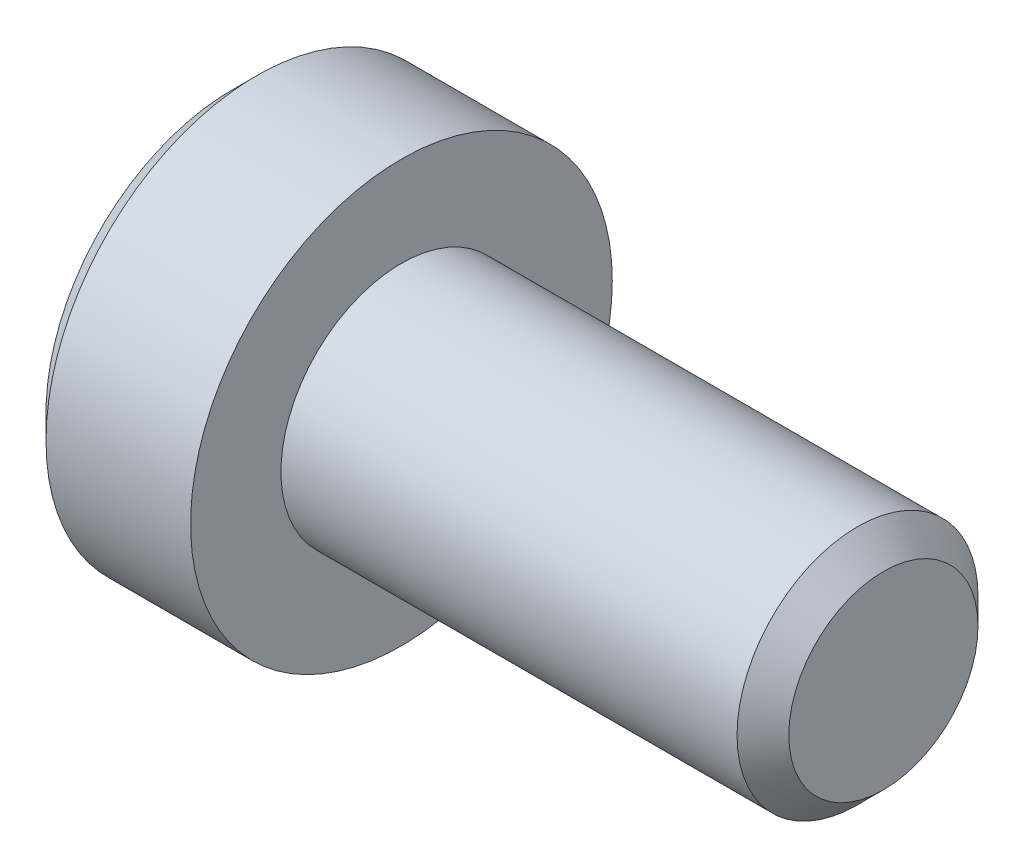
ISO-10303-21;
HEADER;
FILE_DESCRIPTION(('STEP AP214'),'2;1');
FILE_NAME('part.step','',(''),(''),'','','');
FILE_SCHEMA(('AUTOMOTIVE_DESIGN { 1 0 10303 214 1 1 1 1 }'));
ENDSEC;
DATA;
#1=APPLICATION_CONTEXT('core data for automotive mechanical design processes');
#2=APPLICATION_PROTOCOL_DEFINITION('international standard','automotive_design',2000,#1);
#3=PRODUCT_CONTEXT('',#1,'mechanical');
#4=PRODUCT('Part','Part','',(#3));
#5=PRODUCT_RELATED_PRODUCT_CATEGORY('part','',(#4));
#6=PRODUCT_DEFINITION_FORMATION('','',#4);
#7=PRODUCT_DEFINITION_CONTEXT('part definition',#1,'design');
#8=PRODUCT_DEFINITION('design','',#6,#7);
#9=PRODUCT_DEFINITION_SHAPE('','',#8);
#10=(LENGTH_UNIT() NAMED_UNIT(*) SI_UNIT(.MILLI.,.METRE.));
#11=(NAMED_UNIT(*) PLANE_ANGLE_UNIT() SI_UNIT($,.RADIAN.));
#12=(NAMED_UNIT(*) SI_UNIT($,.STERADIAN.) SOLID_ANGLE_UNIT());
#13=UNCERTAINTY_MEASURE_WITH_UNIT(LENGTH_MEASURE(1.E-05),#10,'distance_accuracy_value','');
#14=(GEOMETRIC_REPRESENTATION_CONTEXT(3) GLOBAL_UNCERTAINTY_ASSIGNED_CONTEXT((#13)) GLOBAL_UNIT_ASSIGNED_CONTEXT((#10,
#11,#12)) REPRESENTATION_CONTEXT('',''));
#15=CARTESIAN_POINT('',(0.,0.,0.));
#16=DIRECTION('',(0.,0.,1.));
#17=DIRECTION('',(1.,0.,0.));
#18=AXIS2_PLACEMENT_3D('',#15,#16,#17);
#19=CARTESIAN_POINT('',(8.,-1.60191,1.5705));
#20=DIRECTION('',(1.,0.,0.));
#21=DIRECTION('',(0.,0.,-1.));
#22=AXIS2_PLACEMENT_3D('',#19,#20,#21);
#23=PLANE('',#22);
#24=CARTESIAN_POINT('',(8.,0.,0.));
#25=DIRECTION('',(-1.,0.,0.));
#26=DIRECTION('',(0.,0.,1.));
#27=AXIS2_PLACEMENT_3D('',#24,#25,#26);
#28=CIRCLE('',#27,1.5705);
#29=CARTESIAN_POINT('',(8.,0.,1.5705));
#30=VERTEX_POINT('',#29);
#31=EDGE_CURVE('E20',#30,#30,#28,.T.);
#32=ORIENTED_EDGE('',*,*,#31,.F.);
#33=EDGE_LOOP('',(#32));
#34=FACE_BOUND('',#33,.T.);
#35=ADVANCED_FACE('F16',(#34),#23,.T.);
#36=CARTESIAN_POINT('',(-2.8,0.,1.4433756729741));
#37=DIRECTION('',(0.,0.500000000000019,-0.866025403784427));
#38=DIRECTION('',(1.,0.,0.));
#39=AXIS2_PLACEMENT_3D('',#36,#37,#38);
#40=PLANE('',#39);
#41=DIRECTION('',(0.,0.866025403784427,0.500000000000019));
#42=VECTOR('',#41,1.);
#43=CARTESIAN_POINT('',(-2.8,-0.625,1.08253175473056));
#44=LINE('',#43,#42);
#45=CARTESIAN_POINT('',(-2.8,-1.25,0.72168783648703));
#46=VERTEX_POINT('',#45);
#47=CARTESIAN_POINT('',(-2.8,0.,1.4433756729741));
#48=VERTEX_POINT('',#47);
#49=EDGE_CURVE('E68',#46,#48,#44,.T.);
#50=ORIENTED_EDGE('',*,*,#49,.T.);
#51=DIRECTION('',(-1.,0.,0.));
#52=VECTOR('',#51,1.);
#53=CARTESIAN_POINT('',(-1.54583333333333,0.,1.4433756729741));
#54=LINE('',#53,#52);
#55=CARTESIAN_POINT('',(-0.5,0.,1.4433756729741));
#56=VERTEX_POINT('',#55);
#57=EDGE_CURVE('E77',#56,#48,#54,.T.);
#58=ORIENTED_EDGE('',*,*,#57,.F.);
#59=CARTESIAN_POINT('',(-0.499999999999983,-1.25000000000001,0.721687836487024));
#60=CARTESIAN_POINT('',(-0.481684715704141,-1.19507007027311,0.753401646201419));
#61=CARTESIAN_POINT('',(-0.46502792318762,-1.13966598617425,0.7853892090701));
#62=CARTESIAN_POINT('',(-0.435953992125149,-1.0278985333212,0.849918178061453));
#63=CARTESIAN_POINT('',(-0.423547137711292,-0.971533179322117,0.882460730365793));
#64=CARTESIAN_POINT('',(-0.404234974341288,-0.859500978900713,0.947142551437001));
#65=CARTESIAN_POINT('',(-0.397201117248052,-0.803851365239746,0.97927187086446));
#66=CARTESIAN_POINT('',(-0.388805730081513,-0.692290424711271,1.04368160990963));
#67=CARTESIAN_POINT('',(-0.387437246233859,-0.636379503059216,1.07596179557608));
#68=CARTESIAN_POINT('',(-0.390291431346726,-0.531915943931439,1.13627385955901));
#69=CARTESIAN_POINT('',(-0.393813303260144,-0.483347630847629,1.16431478819204));
#70=CARTESIAN_POINT('',(-0.404973312948833,-0.38652741139707,1.22021396795482));
#71=CARTESIAN_POINT('',(-0.412615259230404,-0.338275839655658,1.24807202588855));
#72=CARTESIAN_POINT('',(-0.431718645836452,-0.241256161422176,1.30408636323334));
#73=CARTESIAN_POINT('',(-0.443261026386437,-0.192500327885292,1.33223555685043));
#74=CARTESIAN_POINT('',(-0.469457350524593,-0.0957156437469469,1.38811422029114));
#75=CARTESIAN_POINT('',(-0.484105142970129,-0.0476855541782974,1.4158444054328));
#76=CARTESIAN_POINT('',(-0.5,0.,1.4433756729741));
#77=B_SPLINE_CURVE_WITH_KNOTS('',3,(#59,#60,#61,#62,#63,#64,#65,#66,#67,#68,#69,#70,#71,#72,#73,
#74,#75,#76),.UNSPECIFIED.,.F.,.F.,(4,2,2,2,2,2,2,2,4),(0.,0.198135007223034,0.396746135641943,
0.590442253845577,0.783900555561138,0.952317364144941,1.12089012112152,1.29320101405544,
1.46517373344688),.UNSPECIFIED.);
#78=CARTESIAN_POINT('',(-0.499999999999983,-1.25000000000001,0.721687836487033));
#79=VERTEX_POINT('',#78);
#80=EDGE_CURVE('E63',#79,#56,#77,.T.);
#81=ORIENTED_EDGE('',*,*,#80,.F.);
#82=DIRECTION('',(1.,0.,0.));
#83=VECTOR('',#82,1.);
#84=CARTESIAN_POINT('',(-1.54583333333333,-1.25,0.72168783648703));
#85=LINE('',#84,#83);
#86=EDGE_CURVE('E99',#46,#79,#85,.T.);
#87=ORIENTED_EDGE('',*,*,#86,.F.);
#88=EDGE_LOOP('',(#50,#58,#81,#87));
#89=FACE_BOUND('',#88,.T.);
#90=ADVANCED_FACE('F78',(#89),#40,.T.);
#91=CARTESIAN_POINT('',(8.,0.,0.));
#92=DIRECTION('',(-1.,0.,0.));
#93=DIRECTION('',(0.,0.,1.));
#94=AXIS2_PLACEMENT_3D('',#91,#92,#93);
#95=CONICAL_SURFACE('',#94,1.5705,0.785398163397448);
#96=ORIENTED_EDGE('',*,*,#31,.T.);
#97=EDGE_LOOP('',(#96));
#98=FACE_BOUND('',#97,.T.);
#99=CARTESIAN_POINT('',(7.5705,0.,0.));
#100=DIRECTION('',(-1.,0.,0.));
#101=DIRECTION('',(0.,0.,1.));
#102=AXIS2_PLACEMENT_3D('',#99,#100,#101);
#103=CIRCLE('',#102,2.);
#104=CARTESIAN_POINT('',(7.5705,0.,2.));
#105=VERTEX_POINT('',#104);
#106=EDGE_CURVE('E95',#105,#105,#103,.T.);
#107=ORIENTED_EDGE('',*,*,#106,.F.);
#108=EDGE_LOOP('',(#107));
#109=FACE_BOUND('',#108,.T.);
#110=ADVANCED_FACE('F214',(#98,#109),#95,.T.);
#111=CARTESIAN_POINT('',(-2.8,1.25,0.72168783648703));
#112=DIRECTION('',(0.,-0.500000000000019,-0.866025403784427));
#113=DIRECTION('',(1.,0.,0.));
#114=AXIS2_PLACEMENT_3D('',#111,#112,#113);
#115=PLANE('',#114);
#116=DIRECTION('',(0.,0.866025403784427,-0.500000000000019));
#117=VECTOR('',#116,1.);
#118=CARTESIAN_POINT('',(-2.8,0.625,1.08253175473056));
#119=LINE('',#118,#117);
#120=CARTESIAN_POINT('',(-2.8,1.25,0.72168783648703));
#121=VERTEX_POINT('',#120);
#122=EDGE_CURVE('E81',#48,#121,#119,.T.);
#123=ORIENTED_EDGE('',*,*,#122,.T.);
#124=DIRECTION('',(-1.,0.,0.));
#125=VECTOR('',#124,1.);
#126=CARTESIAN_POINT('',(-1.54583333333333,1.25,0.72168783648703));
#127=LINE('',#126,#125);
#128=CARTESIAN_POINT('',(-0.499999999999981,1.25000000000001,0.721687836487027));
#129=VERTEX_POINT('',#128);
#130=EDGE_CURVE('E92',#129,#121,#127,.T.);
#131=ORIENTED_EDGE('',*,*,#130,.F.);
#132=CARTESIAN_POINT('',(-0.5,0.,1.4433756729741));
#133=CARTESIAN_POINT('',(-0.481684715704157,0.054929929726902,1.4116618632597));
#134=CARTESIAN_POINT('',(-0.465027923187634,0.110334013825759,1.37967430039102));
#135=CARTESIAN_POINT('',(-0.435953992125161,0.222101466678814,1.31514533139967));
#136=CARTESIAN_POINT('',(-0.423547137711301,0.278466820677898,1.28260277909533));
#137=CARTESIAN_POINT('',(-0.404234974341294,0.390499021099304,1.21792095802412));
#138=CARTESIAN_POINT('',(-0.397201117248057,0.446148634760272,1.18579163859666));
#139=CARTESIAN_POINT('',(-0.388805730081514,0.557709575288749,1.12138189955149));
#140=CARTESIAN_POINT('',(-0.387437246233859,0.613620496940806,1.08910171388504));
#141=CARTESIAN_POINT('',(-0.390291431346724,0.718084056068582,1.0287896499021));
#142=CARTESIAN_POINT('',(-0.39381330326014,0.766652369152391,1.00074872126908));
#143=CARTESIAN_POINT('',(-0.404973312948827,0.863472588602949,0.944849541506299));
#144=CARTESIAN_POINT('',(-0.412615259230397,0.911724160344359,0.916991483572571));
#145=CARTESIAN_POINT('',(-0.431718645836441,1.00874383857784,0.860977146227778));
#146=CARTESIAN_POINT('',(-0.443261026386426,1.05749967211472,0.832827952610692));
#147=CARTESIAN_POINT('',(-0.469457350524579,1.15428435625307,0.776949289169984));
#148=CARTESIAN_POINT('',(-0.484105142970113,1.20231444582171,0.749219104028321));
#149=CARTESIAN_POINT('',(-0.499999999999983,1.25000000000001,0.721687836487024));
#150=B_SPLINE_CURVE_WITH_KNOTS('',3,(#132,#133,#134,#135,#136,#137,#138,#139,#140,#141,#142,
#143,#144,#145,#146,#147,#148,#149),.UNSPECIFIED.,.F.,.F.,(4,2,2,2,2,2,2,2,4),(0.,
0.198135007223038,0.396746135641951,0.590442253845588,0.783900555561154,0.952317364144953,
1.12089012112153,1.29320101405544,1.46517373344688),.UNSPECIFIED.);
#151=EDGE_CURVE('E85',#56,#129,#150,.T.);
#152=ORIENTED_EDGE('',*,*,#151,.F.);
#153=ORIENTED_EDGE('',*,*,#57,.T.);
#154=EDGE_LOOP('',(#123,#131,#152,#153));
#155=FACE_BOUND('',#154,.T.);
#156=ADVANCED_FACE('F90',(#155),#115,.T.);
#157=CARTESIAN_POINT('',(-2.8,-1.25,0.72168783648703));
#158=DIRECTION('',(0.,1.,0.));
#159=DIRECTION('',(1.,0.,0.));
#160=AXIS2_PLACEMENT_3D('',#157,#158,#159);
#161=PLANE('',#160);
#162=DIRECTION('',(0.,0.,1.));
#163=VECTOR('',#162,1.);
#164=CARTESIAN_POINT('',(-2.8,-1.25,0.));
#165=LINE('',#164,#163);
#166=CARTESIAN_POINT('',(-2.8,-1.25,-0.72168783648703));
#167=VERTEX_POINT('',#166);
#168=EDGE_CURVE('E193',#167,#46,#165,.T.);
#169=ORIENTED_EDGE('',*,*,#168,.T.);
#170=ORIENTED_EDGE('',*,*,#86,.T.);
#171=CARTESIAN_POINT('',(-0.499999999999983,-1.25,0.721687836487043));
#172=CARTESIAN_POINT('',(-0.48168471570414,-1.25,0.658260217058255));
#173=CARTESIAN_POINT('',(-0.465027923187618,-1.25,0.594285091320896));
#174=CARTESIAN_POINT('',(-0.435953992125147,-1.25,0.465227153338196));
#175=CARTESIAN_POINT('',(-0.423547137711289,-1.25,0.400142048729517));
#176=CARTESIAN_POINT('',(-0.404234974341283,-1.25,0.270778406587108));
#177=CARTESIAN_POINT('',(-0.397201117248046,-1.25,0.206519767732192));
#178=CARTESIAN_POINT('',(-0.388805730081505,-1.25,0.0777002896418647));
#179=CARTESIAN_POINT('',(-0.38743724623385,-1.25,0.0131399183089552));
#180=CARTESIAN_POINT('',(-0.390291431346716,-1.25,-0.107484209656902));
#181=CARTESIAN_POINT('',(-0.393813303260133,-1.25,-0.163566066922949));
#182=CARTESIAN_POINT('',(-0.404973312948822,-1.25,-0.275364426448508));
#183=CARTESIAN_POINT('',(-0.412615259230392,-1.25,-0.33108054231596));
#184=CARTESIAN_POINT('',(-0.431718645836438,-1.25,-0.443109217005544));
#185=CARTESIAN_POINT('',(-0.443261026386423,-1.25,-0.499407604239713));
#186=CARTESIAN_POINT('',(-0.469457350524577,-1.25,-0.611164931121126));
#187=CARTESIAN_POINT('',(-0.484105142970113,-1.25,-0.666625301404449));
#188=CARTESIAN_POINT('',(-0.499999999999983,-1.25,-0.721687836487042));
#189=B_SPLINE_CURVE_WITH_KNOTS('',3,(#171,#172,#173,#174,#175,#176,#177,#178,#179,#180,#181,
#182,#183,#184,#185,#186,#187,#188),.UNSPECIFIED.,.F.,.F.,(4,2,2,2,2,2,2,2,4),(0.,
0.198135007223034,0.396746135641943,0.590442253845576,0.783900555561138,0.952317364144939,
1.12089012112151,1.29320101405543,1.46517373344687),.UNSPECIFIED.);
#190=CARTESIAN_POINT('',(-0.499999999999983,-1.25000000000001,-0.721687836487033));
#191=VERTEX_POINT('',#190);
#192=EDGE_CURVE('E88',#79,#191,#189,.T.);
#193=ORIENTED_EDGE('',*,*,#192,.T.);
#194=DIRECTION('',(1.,0.,0.));
#195=VECTOR('',#194,1.);
#196=CARTESIAN_POINT('',(-1.54583333333333,-1.25,-0.72168783648703));
#197=LINE('',#196,#195);
#198=EDGE_CURVE('E186',#167,#191,#197,.T.);
#199=ORIENTED_EDGE('',*,*,#198,.F.);
#200=EDGE_LOOP('',(#169,#170,#193,#199));
#201=FACE_BOUND('',#200,.T.);
#202=ADVANCED_FACE('F211',(#201),#161,.T.);
#203=CARTESIAN_POINT('',(0.,0.,0.));
#204=DIRECTION('',(1.,0.,0.));
#205=DIRECTION('',(0.,0.,-1.));
#206=AXIS2_PLACEMENT_3D('',#203,#204,#205);
#207=CYLINDRICAL_SURFACE('',#206,2.);
#208=CARTESIAN_POINT('',(0.,0.,0.));
#209=DIRECTION('',(1.,0.,0.));
#210=DIRECTION('',(0.,0.,-1.));
#211=AXIS2_PLACEMENT_3D('',#208,#209,#210);
#212=CIRCLE('',#211,2.);
#213=CARTESIAN_POINT('',(0.,0.,-2.));
#214=VERTEX_POINT('',#213);
#215=EDGE_CURVE('E148',#214,#214,#212,.F.);
#216=ORIENTED_EDGE('',*,*,#215,.F.);
#217=EDGE_LOOP('',(#216));
#218=FACE_BOUND('',#217,.T.);
#219=ORIENTED_EDGE('',*,*,#106,.T.);
#220=EDGE_LOOP('',(#219));
#221=FACE_BOUND('',#220,.T.);
#222=ADVANCED_FACE('F122',(#218,#221),#207,.T.);
#223=CARTESIAN_POINT('',(-0.5,0.,0.));
#224=DIRECTION('',(-1.,0.,0.));
#225=DIRECTION('',(0.,0.,1.));
#226=AXIS2_PLACEMENT_3D('',#223,#224,#225);
#227=CONICAL_SURFACE('',#226,1.4433756729741,1.04719755119661);
#228=ORIENTED_EDGE('',*,*,#80,.T.);
#229=ORIENTED_EDGE('',*,*,#151,.T.);
#230=CARTESIAN_POINT('',(-0.499999999999983,1.25,-0.721687836487043));
#231=CARTESIAN_POINT('',(-0.48168471570414,1.25,-0.658260217058255));
#232=CARTESIAN_POINT('',(-0.465027923187618,1.25,-0.594285091320896));
#233=CARTESIAN_POINT('',(-0.435953992125147,1.25,-0.465227153338196));
#234=CARTESIAN_POINT('',(-0.423547137711289,1.25,-0.400142048729517));
#235=CARTESIAN_POINT('',(-0.404234974341283,1.25,-0.270778406587108));
#236=CARTESIAN_POINT('',(-0.397201117248046,1.25,-0.206519767732192));
#237=CARTESIAN_POINT('',(-0.388805730081505,1.25,-0.0777002896418647));
#238=CARTESIAN_POINT('',(-0.38743724623385,1.25,-0.0131399183089552));
#239=CARTESIAN_POINT('',(-0.390291431346716,1.25,0.107484209656902));
#240=CARTESIAN_POINT('',(-0.393813303260133,1.25,0.163566066922949));
#241=CARTESIAN_POINT('',(-0.404973312948822,1.25,0.275364426448508));
#242=CARTESIAN_POINT('',(-0.412615259230392,1.25,0.33108054231596));
#243=CARTESIAN_POINT('',(-0.431718645836438,1.25,0.443109217005544));
#244=CARTESIAN_POINT('',(-0.443261026386423,1.25,0.499407604239713));
#245=CARTESIAN_POINT('',(-0.469457350524577,1.25,0.611164931121126));
#246=CARTESIAN_POINT('',(-0.484105142970113,1.25,0.666625301404449));
#247=CARTESIAN_POINT('',(-0.499999999999983,1.25,0.721687836487042));
#248=B_SPLINE_CURVE_WITH_KNOTS('',3,(#230,#231,#232,#233,#234,#235,#236,#237,#238,#239,#240,
#241,#242,#243,#244,#245,#246,#247),.UNSPECIFIED.,.F.,.F.,(4,2,2,2,2,2,2,2,4),(0.,
0.198135007223034,0.396746135641943,0.590442253845576,0.783900555561138,0.952317364144939,
1.12089012112151,1.29320101405543,1.46517373344687),.UNSPECIFIED.);
#249=CARTESIAN_POINT('',(-0.499999999999981,1.25,-0.721687836487036));
#250=VERTEX_POINT('',#249);
#251=EDGE_CURVE('E94',#250,#129,#248,.T.);
#252=ORIENTED_EDGE('',*,*,#251,.F.);
#253=CARTESIAN_POINT('',(-0.5,0.,-1.4433756729741));
#254=CARTESIAN_POINT('',(-0.481684715704157,0.0549299297269023,-1.4116618632597));
#255=CARTESIAN_POINT('',(-0.465027923187634,0.110334013825759,-1.37967430039102));
#256=CARTESIAN_POINT('',(-0.43595399212516,0.222101466678814,-1.31514533139967));
#257=CARTESIAN_POINT('',(-0.423547137711301,0.278466820677899,-1.28260277909533));
#258=CARTESIAN_POINT('',(-0.404234974341294,0.390499021099305,-1.21792095802412));
#259=CARTESIAN_POINT('',(-0.397201117248057,0.446148634760272,-1.18579163859666));
#260=CARTESIAN_POINT('',(-0.388805730081514,0.557709575288749,-1.12138189955149));
#261=CARTESIAN_POINT('',(-0.387437246233859,0.613620496940806,-1.08910171388504));
#262=CARTESIAN_POINT('',(-0.390291431346724,0.718084056068582,-1.0287896499021));
#263=CARTESIAN_POINT('',(-0.39381330326014,0.766652369152391,-1.00074872126908));
#264=CARTESIAN_POINT('',(-0.404973312948827,0.863472588602949,-0.944849541506298));
#265=CARTESIAN_POINT('',(-0.412615259230397,0.911724160344359,-0.916991483572571));
#266=CARTESIAN_POINT('',(-0.431718645836441,1.00874383857784,-0.860977146227778));
#267=CARTESIAN_POINT('',(-0.443261026386425,1.05749967211472,-0.832827952610692));
#268=CARTESIAN_POINT('',(-0.469457350524578,1.15428435625307,-0.776949289169984));
#269=CARTESIAN_POINT('',(-0.484105142970113,1.20231444582171,-0.749219104028321));
#270=CARTESIAN_POINT('',(-0.499999999999983,1.25000000000001,-0.721687836487024));
#271=B_SPLINE_CURVE_WITH_KNOTS('',3,(#253,#254,#255,#256,#257,#258,#259,#260,#261,#262,#263,
#264,#265,#266,#267,#268,#269,#270),.UNSPECIFIED.,.F.,.F.,(4,2,2,2,2,2,2,2,4),(0.,
0.198135007223038,0.396746135641951,0.590442253845588,0.783900555561154,0.952317364144953,
1.12089012112153,1.29320101405544,1.46517373344688),.UNSPECIFIED.);
#272=CARTESIAN_POINT('',(-0.5,0.,-1.4433756729741));
#273=VERTEX_POINT('',#272);
#274=EDGE_CURVE('E128',#273,#250,#271,.T.);
#275=ORIENTED_EDGE('',*,*,#274,.F.);
#276=CARTESIAN_POINT('',(-0.499999999999983,-1.25000000000001,-0.721687836487024));
#277=CARTESIAN_POINT('',(-0.481684715704141,-1.19507007027311,-0.753401646201419));
#278=CARTESIAN_POINT('',(-0.46502792318762,-1.13966598617425,-0.7853892090701));
#279=CARTESIAN_POINT('',(-0.435953992125149,-1.0278985333212,-0.849918178061452));
#280=CARTESIAN_POINT('',(-0.423547137711292,-0.971533179322117,-0.882460730365793));
#281=CARTESIAN_POINT('',(-0.404234974341288,-0.859500978900713,-0.947142551437));
#282=CARTESIAN_POINT('',(-0.397201117248052,-0.803851365239746,-0.979271870864459));
#283=CARTESIAN_POINT('',(-0.388805730081512,-0.692290424711271,-1.04368160990963));
#284=CARTESIAN_POINT('',(-0.387437246233858,-0.636379503059216,-1.07596179557608));
#285=CARTESIAN_POINT('',(-0.390291431346726,-0.531915943931439,-1.13627385955901));
#286=CARTESIAN_POINT('',(-0.393813303260143,-0.483347630847629,-1.16431478819204));
#287=CARTESIAN_POINT('',(-0.404973312948833,-0.386527411397069,-1.22021396795482));
#288=CARTESIAN_POINT('',(-0.412615259230404,-0.338275839655658,-1.24807202588855));
#289=CARTESIAN_POINT('',(-0.431718645836451,-0.241256161422176,-1.30408636323334));
#290=CARTESIAN_POINT('',(-0.443261026386437,-0.192500327885292,-1.33223555685043));
#291=CARTESIAN_POINT('',(-0.469457350524593,-0.0957156437469463,-1.38811422029114));
#292=CARTESIAN_POINT('',(-0.484105142970129,-0.0476855541782967,-1.4158444054328));
#293=CARTESIAN_POINT('',(-0.5,0.,-1.4433756729741));
#294=B_SPLINE_CURVE_WITH_KNOTS('',3,(#276,#277,#278,#279,#280,#281,#282,#283,#284,#285,#286,
#287,#288,#289,#290,#291,#292,#293),.UNSPECIFIED.,.F.,.F.,(4,2,2,2,2,2,2,2,4),(0.,
0.198135007223034,0.396746135641943,0.590442253845576,0.783900555561138,0.952317364144942,
1.12089012112152,1.29320101405544,1.46517373344688),.UNSPECIFIED.);
#295=EDGE_CURVE('E142',#191,#273,#294,.T.);
#296=ORIENTED_EDGE('',*,*,#295,.F.);
#297=ORIENTED_EDGE('',*,*,#192,.F.);
#298=EDGE_LOOP('',(#228,#229,#252,#275,#296,#297));
#299=FACE_BOUND('',#298,.T.);
#300=CARTESIAN_POINT('',(0.33333333333333,0.,0.));
#301=VERTEX_POINT('',#300);
#302=VERTEX_LOOP('',#301);
#303=FACE_BOUND('',#302,.T.);
#304=ADVANCED_FACE('F84',(#299,#303),#227,.F.);
#305=CARTESIAN_POINT('',(-2.8,1.25,-0.72168783648703));
#306=DIRECTION('',(0.,-1.,0.));
#307=DIRECTION('',(1.,0.,0.));
#308=AXIS2_PLACEMENT_3D('',#305,#306,#307);
#309=PLANE('',#308);
#310=DIRECTION('',(0.,0.,-1.));
#311=VECTOR('',#310,1.);
#312=CARTESIAN_POINT('',(-2.8,1.25,0.));
#313=LINE('',#312,#311);
#314=CARTESIAN_POINT('',(-2.8,1.25,-0.72168783648703));
#315=VERTEX_POINT('',#314);
#316=EDGE_CURVE('E147',#121,#315,#313,.T.);
#317=ORIENTED_EDGE('',*,*,#316,.T.);
#318=DIRECTION('',(-1.,0.,0.));
#319=VECTOR('',#318,1.);
#320=CARTESIAN_POINT('',(-1.54583333333333,1.25,-0.72168783648703));
#321=LINE('',#320,#319);
#322=EDGE_CURVE('E184',#250,#315,#321,.T.);
#323=ORIENTED_EDGE('',*,*,#322,.F.);
#324=ORIENTED_EDGE('',*,*,#251,.T.);
#325=ORIENTED_EDGE('',*,*,#130,.T.);
#326=EDGE_LOOP('',(#317,#323,#324,#325));
#327=FACE_BOUND('',#326,.T.);
#328=ADVANCED_FACE('F121',(#327),#309,.T.);
#329=CARTESIAN_POINT('',(-2.8,-1.25,-0.72168783648703));
#330=DIRECTION('',(0.,0.500000000000019,0.866025403784428));
#331=DIRECTION('',(1.,0.,0.));
#332=AXIS2_PLACEMENT_3D('',#329,#330,#331);
#333=PLANE('',#332);
#334=DIRECTION('',(0.,-0.866025403784428,0.500000000000019));
#335=VECTOR('',#334,1.);
#336=CARTESIAN_POINT('',(-2.8,-0.624999999999999,-1.08253175473056));
#337=LINE('',#336,#335);
#338=CARTESIAN_POINT('',(-2.8,0.,-1.4433756729741));
#339=VERTEX_POINT('',#338);
#340=EDGE_CURVE('E35',#339,#167,#337,.T.);
#341=ORIENTED_EDGE('',*,*,#340,.T.);
#342=ORIENTED_EDGE('',*,*,#198,.T.);
#343=ORIENTED_EDGE('',*,*,#295,.T.);
#344=DIRECTION('',(1.,0.,0.));
#345=VECTOR('',#344,1.);
#346=CARTESIAN_POINT('',(-1.54583333333333,0.,-1.4433756729741));
#347=LINE('',#346,#345);
#348=EDGE_CURVE('E198',#339,#273,#347,.T.);
#349=ORIENTED_EDGE('',*,*,#348,.F.);
#350=EDGE_LOOP('',(#341,#342,#343,#349));
#351=FACE_BOUND('',#350,.T.);
#352=ADVANCED_FACE('F149',(#351),#333,.T.);
#353=CARTESIAN_POINT('',(0.,-3.57,3.5));
#354=DIRECTION('',(1.,0.,0.));
#355=DIRECTION('',(0.,0.,-1.));
#356=AXIS2_PLACEMENT_3D('',#353,#354,#355);
#357=PLANE('',#356);
#358=CARTESIAN_POINT('',(0.,0.,0.));
#359=DIRECTION('',(1.,0.,0.));
#360=DIRECTION('',(0.,0.,-1.));
#361=AXIS2_PLACEMENT_3D('',#358,#359,#360);
#362=CIRCLE('',#361,3.5);
#363=CARTESIAN_POINT('',(0.,0.,-3.5));
#364=VERTEX_POINT('',#363);
#365=EDGE_CURVE('E180',#364,#364,#362,.F.);
#366=ORIENTED_EDGE('',*,*,#365,.F.);
#367=EDGE_LOOP('',(#366));
#368=FACE_BOUND('',#367,.T.);
#369=ORIENTED_EDGE('',*,*,#215,.T.);
#370=EDGE_LOOP('',(#369));
#371=FACE_BOUND('',#370,.T.);
#372=ADVANCED_FACE('F153',(#368,#371),#357,.T.);
#373=CARTESIAN_POINT('',(-2.8,0.,-1.4433756729741));
#374=DIRECTION('',(0.,-0.500000000000019,0.866025403784427));
#375=DIRECTION('',(1.,0.,0.));
#376=AXIS2_PLACEMENT_3D('',#373,#374,#375);
#377=PLANE('',#376);
#378=DIRECTION('',(0.,0.866025403784428,0.500000000000019));
#379=VECTOR('',#378,1.);
#380=CARTESIAN_POINT('',(-2.8,0.,-1.4433756729741));
#381=LINE('',#380,#379);
#382=EDGE_CURVE('E178',#339,#315,#381,.T.);
#383=ORIENTED_EDGE('',*,*,#382,.F.);
#384=ORIENTED_EDGE('',*,*,#348,.T.);
#385=ORIENTED_EDGE('',*,*,#274,.T.);
#386=ORIENTED_EDGE('',*,*,#322,.T.);
#387=EDGE_LOOP('',(#383,#384,#385,#386));
#388=FACE_BOUND('',#387,.T.);
#389=ADVANCED_FACE('F156',(#388),#377,.T.);
#390=CARTESIAN_POINT('',(-2.4,0.,0.));
#391=DIRECTION('',(1.,0.,0.));
#392=DIRECTION('',(0.,0.,-1.));
#393=AXIS2_PLACEMENT_3D('',#390,#391,#392);
#394=CYLINDRICAL_SURFACE('',#393,3.5);
#395=ORIENTED_EDGE('',*,*,#365,.T.);
#396=EDGE_LOOP('',(#395));
#397=FACE_BOUND('',#396,.T.);
#398=CARTESIAN_POINT('',(-2.4,0.,0.));
#399=DIRECTION('',(-1.,0.,0.));
#400=DIRECTION('',(0.,0.,1.));
#401=AXIS2_PLACEMENT_3D('',#398,#399,#400);
#402=CIRCLE('',#401,3.5);
#403=CARTESIAN_POINT('',(-2.4,0.,3.5));
#404=VERTEX_POINT('',#403);
#405=EDGE_CURVE('E26',#404,#404,#402,.T.);
#406=ORIENTED_EDGE('',*,*,#405,.F.);
#407=EDGE_LOOP('',(#406));
#408=FACE_BOUND('',#407,.T.);
#409=ADVANCED_FACE('F161',(#397,#408),#394,.T.);
#410=CARTESIAN_POINT('',(-2.8,-3.162,-3.1));
#411=DIRECTION('',(-1.,0.,0.));
#412=DIRECTION('',(0.,0.,1.));
#413=AXIS2_PLACEMENT_3D('',#410,#411,#412);
#414=PLANE('',#413);
#415=ORIENTED_EDGE('',*,*,#340,.F.);
#416=ORIENTED_EDGE('',*,*,#382,.T.);
#417=ORIENTED_EDGE('',*,*,#316,.F.);
#418=ORIENTED_EDGE('',*,*,#122,.F.);
#419=ORIENTED_EDGE('',*,*,#49,.F.);
#420=ORIENTED_EDGE('',*,*,#168,.F.);
#421=EDGE_LOOP('',(#415,#416,#417,#418,#419,#420));
#422=FACE_BOUND('',#421,.T.);
#423=CARTESIAN_POINT('',(-2.8,0.,0.));
#424=DIRECTION('',(1.,0.,0.));
#425=DIRECTION('',(0.,0.,-1.));
#426=AXIS2_PLACEMENT_3D('',#423,#424,#425);
#427=CIRCLE('',#426,3.1);
#428=CARTESIAN_POINT('',(-2.8,0.,-3.1));
#429=VERTEX_POINT('',#428);
#430=EDGE_CURVE('E10',#429,#429,#427,.T.);
#431=ORIENTED_EDGE('',*,*,#430,.F.);
#432=EDGE_LOOP('',(#431));
#433=FACE_BOUND('',#432,.T.);
#434=ADVANCED_FACE('F164',(#422,#433),#414,.T.);
#435=CARTESIAN_POINT('',(-2.8,0.,0.));
#436=DIRECTION('',(1.,0.,0.));
#437=DIRECTION('',(0.,0.,-1.));
#438=AXIS2_PLACEMENT_3D('',#435,#436,#437);
#439=CONICAL_SURFACE('',#438,3.1,0.785398163397448);
#440=ORIENTED_EDGE('',*,*,#430,.T.);
#441=EDGE_LOOP('',(#440));
#442=FACE_BOUND('',#441,.T.);
#443=ORIENTED_EDGE('',*,*,#405,.T.);
#444=EDGE_LOOP('',(#443));
#445=FACE_BOUND('',#444,.T.);
#446=ADVANCED_FACE('F18',(#442,#445),#439,.T.);
#447=CLOSED_SHELL('',(#35,#90,#110,#156,#202,#222,#304,#328,#352,#372,#389,#409,#434,#446));
#448=MANIFOLD_SOLID_BREP('B1',#447);
#449=ADVANCED_BREP_SHAPE_REPRESENTATION('',(#18,#448),#14);
#450=SHAPE_DEFINITION_REPRESENTATION(#9,#449);
ENDSEC;
END-ISO-10303-21;
